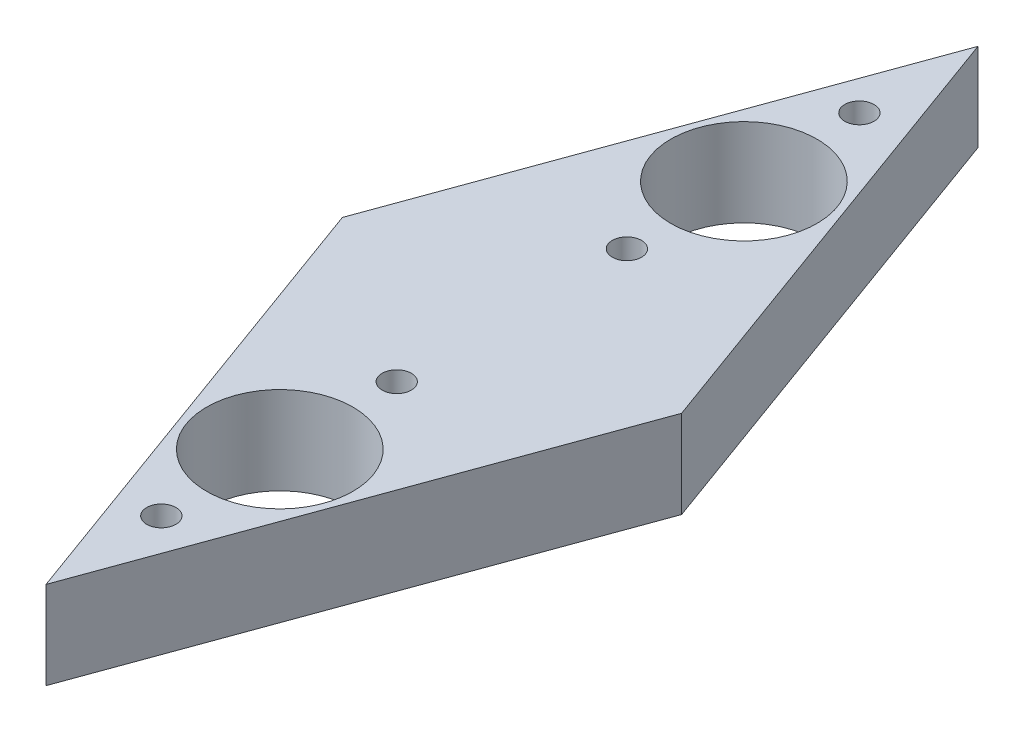
ISO-10303-21;
HEADER;
FILE_DESCRIPTION(('STEP AP214'),'2;1');
FILE_NAME('part.step','',(''),(''),'','','');
FILE_SCHEMA(('AUTOMOTIVE_DESIGN { 1 0 10303 214 1 1 1 1 }'));
ENDSEC;
DATA;
#1=APPLICATION_CONTEXT('core data for automotive mechanical design processes');
#2=APPLICATION_PROTOCOL_DEFINITION('international standard','automotive_design',2000,#1);
#3=PRODUCT_CONTEXT('',#1,'mechanical');
#4=PRODUCT('Part','Part','',(#3));
#5=PRODUCT_RELATED_PRODUCT_CATEGORY('part','',(#4));
#6=PRODUCT_DEFINITION_FORMATION('','',#4);
#7=PRODUCT_DEFINITION_CONTEXT('part definition',#1,'design');
#8=PRODUCT_DEFINITION('design','',#6,#7);
#9=PRODUCT_DEFINITION_SHAPE('','',#8);
#10=(LENGTH_UNIT() NAMED_UNIT(*) SI_UNIT(.MILLI.,.METRE.));
#11=(NAMED_UNIT(*) PLANE_ANGLE_UNIT() SI_UNIT($,.RADIAN.));
#12=(NAMED_UNIT(*) SI_UNIT($,.STERADIAN.) SOLID_ANGLE_UNIT());
#13=UNCERTAINTY_MEASURE_WITH_UNIT(LENGTH_MEASURE(1.E-05),#10,'distance_accuracy_value','');
#14=(GEOMETRIC_REPRESENTATION_CONTEXT(3) GLOBAL_UNCERTAINTY_ASSIGNED_CONTEXT((#13)) GLOBAL_UNIT_ASSIGNED_CONTEXT((#10,
#11,#12)) REPRESENTATION_CONTEXT('',''));
#15=CARTESIAN_POINT('',(0.,0.,0.));
#16=DIRECTION('',(0.,0.,1.));
#17=DIRECTION('',(1.,0.,0.));
#18=AXIS2_PLACEMENT_3D('',#15,#16,#17);
#19=CARTESIAN_POINT('',(0.,15.,0.));
#20=DIRECTION('',(-0.939692620785909,0.,-0.342020143325666));
#21=DIRECTION('',(-0.342020143325666,0.,0.93969262078591));
#22=AXIS2_PLACEMENT_3D('',#19,#20,#21);
#23=PLANE('',#22);
#24=DIRECTION('',(0.342020143325666,0.,-0.93969262078591));
#25=VECTOR('',#24,1.);
#26=CARTESIAN_POINT('',(0.,0.,0.));
#27=LINE('',#26,#25);
#28=CARTESIAN_POINT('',(0.,0.,0.));
#29=VERTEX_POINT('',#28);
#30=CARTESIAN_POINT('',(29.,0.,-79.6768451641848));
#31=VERTEX_POINT('',#30);
#32=EDGE_CURVE('E98',#29,#31,#27,.T.);
#33=ORIENTED_EDGE('',*,*,#32,.F.);
#34=DIRECTION('',(0.,-1.,0.));
#35=VECTOR('',#34,1.);
#36=CARTESIAN_POINT('',(0.,15.,0.));
#37=LINE('',#36,#35);
#38=CARTESIAN_POINT('',(0.,15.,0.));
#39=VERTEX_POINT('',#38);
#40=EDGE_CURVE('E11',#39,#29,#37,.T.);
#41=ORIENTED_EDGE('',*,*,#40,.F.);
#42=DIRECTION('',(0.342020143325666,0.,-0.93969262078591));
#43=VECTOR('',#42,1.);
#44=CARTESIAN_POINT('',(0.,15.,0.));
#45=LINE('',#44,#43);
#46=CARTESIAN_POINT('',(29.,15.,-79.6768451641848));
#47=VERTEX_POINT('',#46);
#48=EDGE_CURVE('E83',#39,#47,#45,.T.);
#49=ORIENTED_EDGE('',*,*,#48,.T.);
#50=DIRECTION('',(0.,-1.,0.));
#51=VECTOR('',#50,1.);
#52=CARTESIAN_POINT('',(29.,15.,-79.6768451641848));
#53=LINE('',#52,#51);
#54=EDGE_CURVE('E51',#47,#31,#53,.T.);
#55=ORIENTED_EDGE('',*,*,#54,.T.);
#56=EDGE_LOOP('',(#33,#41,#49,#55));
#57=FACE_BOUND('',#56,.T.);
#58=ADVANCED_FACE('F35',(#57),#23,.T.);
#59=CARTESIAN_POINT('',(0.,15.,0.));
#60=DIRECTION('',(0.939692620785909,0.,-0.342020143325666));
#61=DIRECTION('',(-0.342020143325666,0.,-0.93969262078591));
#62=AXIS2_PLACEMENT_3D('',#59,#60,#61);
#63=PLANE('',#62);
#64=DIRECTION('',(0.342020143325666,0.,0.93969262078591));
#65=VECTOR('',#64,1.);
#66=CARTESIAN_POINT('',(0.,0.,0.));
#67=LINE('',#66,#65);
#68=CARTESIAN_POINT('',(29.,0.,79.6768451641848));
#69=VERTEX_POINT('',#68);
#70=EDGE_CURVE('E89',#29,#69,#67,.T.);
#71=ORIENTED_EDGE('',*,*,#70,.T.);
#72=DIRECTION('',(0.,-1.,0.));
#73=VECTOR('',#72,1.);
#74=CARTESIAN_POINT('',(29.,15.,79.6768451641848));
#75=LINE('',#74,#73);
#76=CARTESIAN_POINT('',(29.,15.,79.6768451641848));
#77=VERTEX_POINT('',#76);
#78=EDGE_CURVE('E43',#77,#69,#75,.T.);
#79=ORIENTED_EDGE('',*,*,#78,.F.);
#80=DIRECTION('',(0.342020143325666,0.,0.93969262078591));
#81=VECTOR('',#80,1.);
#82=CARTESIAN_POINT('',(0.,15.,0.));
#83=LINE('',#82,#81);
#84=EDGE_CURVE('E77',#39,#77,#83,.T.);
#85=ORIENTED_EDGE('',*,*,#84,.F.);
#86=ORIENTED_EDGE('',*,*,#40,.T.);
#87=EDGE_LOOP('',(#71,#79,#85,#86));
#88=FACE_BOUND('',#87,.T.);
#89=ADVANCED_FACE('F87',(#88),#63,.F.);
#90=CARTESIAN_POINT('',(51.2152888504505,15.,18.6408406809095));
#91=DIRECTION('',(-0.939692620785909,0.,-0.342020143325666));
#92=DIRECTION('',(-0.342020143325666,0.,0.93969262078591));
#93=AXIS2_PLACEMENT_3D('',#90,#91,#92);
#94=PLANE('',#93);
#95=DIRECTION('',(0.342020143325666,0.,-0.939692620785909));
#96=VECTOR('',#95,1.);
#97=CARTESIAN_POINT('',(51.2152888504505,0.,18.6408406809095));
#98=LINE('',#97,#96);
#99=CARTESIAN_POINT('',(58.,0.,0.));
#100=VERTEX_POINT('',#99);
#101=EDGE_CURVE('E102',#69,#100,#98,.T.);
#102=ORIENTED_EDGE('',*,*,#101,.T.);
#103=DIRECTION('',(0.,-1.,0.));
#104=VECTOR('',#103,1.);
#105=CARTESIAN_POINT('',(58.,15.,0.));
#106=LINE('',#105,#104);
#107=CARTESIAN_POINT('',(58.,15.,0.));
#108=VERTEX_POINT('',#107);
#109=EDGE_CURVE('E65',#108,#100,#106,.T.);
#110=ORIENTED_EDGE('',*,*,#109,.F.);
#111=DIRECTION('',(0.342020143325666,0.,-0.939692620785909));
#112=VECTOR('',#111,1.);
#113=CARTESIAN_POINT('',(51.2152888504505,15.,18.6408406809095));
#114=LINE('',#113,#112);
#115=EDGE_CURVE('E82',#77,#108,#114,.T.);
#116=ORIENTED_EDGE('',*,*,#115,.F.);
#117=ORIENTED_EDGE('',*,*,#78,.T.);
#118=EDGE_LOOP('',(#102,#110,#116,#117));
#119=FACE_BOUND('',#118,.T.);
#120=ADVANCED_FACE('F92',(#119),#94,.F.);
#121=CARTESIAN_POINT('',(51.2152888504505,15.,-18.6408406809095));
#122=DIRECTION('',(0.939692620785909,0.,-0.342020143325666));
#123=DIRECTION('',(-0.342020143325666,0.,-0.93969262078591));
#124=AXIS2_PLACEMENT_3D('',#121,#122,#123);
#125=PLANE('',#124);
#126=DIRECTION('',(0.342020143325666,0.,0.939692620785909));
#127=VECTOR('',#126,1.);
#128=CARTESIAN_POINT('',(51.2152888504505,0.,-18.6408406809095));
#129=LINE('',#128,#127);
#130=EDGE_CURVE('E104',#31,#100,#129,.T.);
#131=ORIENTED_EDGE('',*,*,#130,.F.);
#132=ORIENTED_EDGE('',*,*,#54,.F.);
#133=DIRECTION('',(0.342020143325666,0.,0.939692620785909));
#134=VECTOR('',#133,1.);
#135=CARTESIAN_POINT('',(51.2152888504505,15.,-18.6408406809095));
#136=LINE('',#135,#134);
#137=EDGE_CURVE('E93',#47,#108,#136,.T.);
#138=ORIENTED_EDGE('',*,*,#137,.T.);
#139=ORIENTED_EDGE('',*,*,#109,.T.);
#140=EDGE_LOOP('',(#131,#132,#138,#139));
#141=FACE_BOUND('',#140,.T.);
#142=ADVANCED_FACE('F169',(#141),#125,.T.);
#143=CARTESIAN_POINT('',(0.,15.,0.));
#144=DIRECTION('',(0.,1.,0.));
#145=DIRECTION('',(0.,0.,1.));
#146=AXIS2_PLACEMENT_3D('',#143,#144,#145);
#147=PLANE('',#146);
#148=CARTESIAN_POINT('',(28.971190629352,15.,39.6768451641848));
#149=DIRECTION('',(0.,-1.,0.));
#150=DIRECTION('',(0.,0.,-1.));
#151=AXIS2_PLACEMENT_3D('',#148,#149,#150);
#152=CIRCLE('',#151,12.5);
#153=CARTESIAN_POINT('',(28.971190629352,15.,27.1768451641848));
#154=VERTEX_POINT('',#153);
#155=EDGE_CURVE('E113',#154,#154,#152,.T.);
#156=ORIENTED_EDGE('',*,*,#155,.T.);
#157=EDGE_LOOP('',(#156));
#158=FACE_BOUND('',#157,.T.);
#159=CARTESIAN_POINT('',(28.971190629352,15.,19.6768451641848));
#160=DIRECTION('',(0.,-1.,0.));
#161=DIRECTION('',(0.,0.,-1.));
#162=AXIS2_PLACEMENT_3D('',#159,#160,#161);
#163=CIRCLE('',#162,2.50000000000001);
#164=CARTESIAN_POINT('',(28.971190629352,15.,17.1768451641848));
#165=VERTEX_POINT('',#164);
#166=EDGE_CURVE('E137',#165,#165,#163,.T.);
#167=ORIENTED_EDGE('',*,*,#166,.T.);
#168=EDGE_LOOP('',(#167));
#169=FACE_BOUND('',#168,.T.);
#170=CARTESIAN_POINT('',(28.720595314676,15.,-59.6768451641848));
#171=DIRECTION('',(0.,-1.,0.));
#172=DIRECTION('',(0.,0.,1.));
#173=AXIS2_PLACEMENT_3D('',#170,#171,#172);
#174=CIRCLE('',#173,2.5);
#175=CARTESIAN_POINT('',(28.720595314676,15.,-57.1768451641848));
#176=VERTEX_POINT('',#175);
#177=EDGE_CURVE('E131',#176,#176,#174,.T.);
#178=ORIENTED_EDGE('',*,*,#177,.T.);
#179=EDGE_LOOP('',(#178));
#180=FACE_BOUND('',#179,.T.);
#181=CARTESIAN_POINT('',(28.971190629352,15.,-19.6768451641848));
#182=DIRECTION('',(0.,-1.,0.));
#183=DIRECTION('',(0.,0.,1.));
#184=AXIS2_PLACEMENT_3D('',#181,#182,#183);
#185=CIRCLE('',#184,2.50000000000001);
#186=CARTESIAN_POINT('',(28.971190629352,15.,-17.1768451641848));
#187=VERTEX_POINT('',#186);
#188=EDGE_CURVE('E125',#187,#187,#185,.T.);
#189=ORIENTED_EDGE('',*,*,#188,.T.);
#190=EDGE_LOOP('',(#189));
#191=FACE_BOUND('',#190,.T.);
#192=CARTESIAN_POINT('',(28.971190629352,15.,-39.6768451641848));
#193=DIRECTION('',(0.,-1.,0.));
#194=DIRECTION('',(0.,0.,1.));
#195=AXIS2_PLACEMENT_3D('',#192,#193,#194);
#196=CIRCLE('',#195,12.5);
#197=CARTESIAN_POINT('',(28.971190629352,15.,-27.1768451641848));
#198=VERTEX_POINT('',#197);
#199=EDGE_CURVE('E119',#198,#198,#196,.T.);
#200=ORIENTED_EDGE('',*,*,#199,.T.);
#201=EDGE_LOOP('',(#200));
#202=FACE_BOUND('',#201,.T.);
#203=CARTESIAN_POINT('',(28.720595314676,15.,59.6768451641848));
#204=DIRECTION('',(0.,-1.,0.));
#205=DIRECTION('',(0.,0.,-1.));
#206=AXIS2_PLACEMENT_3D('',#203,#204,#205);
#207=CIRCLE('',#206,2.5);
#208=CARTESIAN_POINT('',(28.720595314676,15.,57.1768451641848));
#209=VERTEX_POINT('',#208);
#210=EDGE_CURVE('E100',#209,#209,#207,.T.);
#211=ORIENTED_EDGE('',*,*,#210,.T.);
#212=EDGE_LOOP('',(#211));
#213=FACE_BOUND('',#212,.T.);
#214=ORIENTED_EDGE('',*,*,#48,.F.);
#215=ORIENTED_EDGE('',*,*,#84,.T.);
#216=ORIENTED_EDGE('',*,*,#115,.T.);
#217=ORIENTED_EDGE('',*,*,#137,.F.);
#218=EDGE_LOOP('',(#214,#215,#216,#217));
#219=FACE_BOUND('',#218,.T.);
#220=ADVANCED_FACE('F79',(#158,#169,#180,#191,#202,#213,#219),#147,.T.);
#221=CARTESIAN_POINT('',(0.,0.,0.));
#222=DIRECTION('',(0.,1.,0.));
#223=DIRECTION('',(0.,0.,1.));
#224=AXIS2_PLACEMENT_3D('',#221,#222,#223);
#225=PLANE('',#224);
#226=CARTESIAN_POINT('',(28.971190629352,0.,39.6768451641848));
#227=DIRECTION('',(0.,-1.,0.));
#228=DIRECTION('',(0.,0.,-1.));
#229=AXIS2_PLACEMENT_3D('',#226,#227,#228);
#230=CIRCLE('',#229,12.5);
#231=CARTESIAN_POINT('',(28.971190629352,0.,27.1768451641848));
#232=VERTEX_POINT('',#231);
#233=EDGE_CURVE('E140',#232,#232,#230,.T.);
#234=ORIENTED_EDGE('',*,*,#233,.F.);
#235=EDGE_LOOP('',(#234));
#236=FACE_BOUND('',#235,.T.);
#237=CARTESIAN_POINT('',(28.971190629352,0.,19.6768451641848));
#238=DIRECTION('',(0.,-1.,0.));
#239=DIRECTION('',(0.,0.,-1.));
#240=AXIS2_PLACEMENT_3D('',#237,#238,#239);
#241=CIRCLE('',#240,2.50000000000001);
#242=CARTESIAN_POINT('',(28.971190629352,0.,17.1768451641848));
#243=VERTEX_POINT('',#242);
#244=EDGE_CURVE('E134',#243,#243,#241,.T.);
#245=ORIENTED_EDGE('',*,*,#244,.F.);
#246=EDGE_LOOP('',(#245));
#247=FACE_BOUND('',#246,.T.);
#248=CARTESIAN_POINT('',(28.720595314676,0.,-59.6768451641848));
#249=DIRECTION('',(0.,-1.,0.));
#250=DIRECTION('',(0.,0.,1.));
#251=AXIS2_PLACEMENT_3D('',#248,#249,#250);
#252=CIRCLE('',#251,2.5);
#253=CARTESIAN_POINT('',(28.720595314676,0.,-57.1768451641848));
#254=VERTEX_POINT('',#253);
#255=EDGE_CURVE('E128',#254,#254,#252,.T.);
#256=ORIENTED_EDGE('',*,*,#255,.F.);
#257=EDGE_LOOP('',(#256));
#258=FACE_BOUND('',#257,.T.);
#259=CARTESIAN_POINT('',(28.971190629352,0.,-19.6768451641848));
#260=DIRECTION('',(0.,-1.,0.));
#261=DIRECTION('',(0.,0.,1.));
#262=AXIS2_PLACEMENT_3D('',#259,#260,#261);
#263=CIRCLE('',#262,2.50000000000001);
#264=CARTESIAN_POINT('',(28.971190629352,0.,-17.1768451641848));
#265=VERTEX_POINT('',#264);
#266=EDGE_CURVE('E122',#265,#265,#263,.T.);
#267=ORIENTED_EDGE('',*,*,#266,.F.);
#268=EDGE_LOOP('',(#267));
#269=FACE_BOUND('',#268,.T.);
#270=CARTESIAN_POINT('',(28.971190629352,0.,-39.6768451641848));
#271=DIRECTION('',(0.,-1.,0.));
#272=DIRECTION('',(0.,0.,1.));
#273=AXIS2_PLACEMENT_3D('',#270,#271,#272);
#274=CIRCLE('',#273,12.5);
#275=CARTESIAN_POINT('',(28.971190629352,0.,-27.1768451641848));
#276=VERTEX_POINT('',#275);
#277=EDGE_CURVE('E116',#276,#276,#274,.T.);
#278=ORIENTED_EDGE('',*,*,#277,.F.);
#279=EDGE_LOOP('',(#278));
#280=FACE_BOUND('',#279,.T.);
#281=CARTESIAN_POINT('',(28.720595314676,0.,59.6768451641848));
#282=DIRECTION('',(0.,-1.,0.));
#283=DIRECTION('',(0.,0.,-1.));
#284=AXIS2_PLACEMENT_3D('',#281,#282,#283);
#285=CIRCLE('',#284,2.5);
#286=CARTESIAN_POINT('',(28.720595314676,0.,57.1768451641848));
#287=VERTEX_POINT('',#286);
#288=EDGE_CURVE('E110',#287,#287,#285,.T.);
#289=ORIENTED_EDGE('',*,*,#288,.F.);
#290=EDGE_LOOP('',(#289));
#291=FACE_BOUND('',#290,.T.);
#292=ORIENTED_EDGE('',*,*,#32,.T.);
#293=ORIENTED_EDGE('',*,*,#130,.T.);
#294=ORIENTED_EDGE('',*,*,#101,.F.);
#295=ORIENTED_EDGE('',*,*,#70,.F.);
#296=EDGE_LOOP('',(#292,#293,#294,#295));
#297=FACE_BOUND('',#296,.T.);
#298=ADVANCED_FACE('F155',(#236,#247,#258,#269,#280,#291,#297),#225,.F.);
#299=CARTESIAN_POINT('',(28.720595314676,15.,59.6768451641848));
#300=DIRECTION('',(0.,-1.,0.));
#301=DIRECTION('',(0.,0.,-1.));
#302=AXIS2_PLACEMENT_3D('',#299,#300,#301);
#303=CYLINDRICAL_SURFACE('',#302,2.5);
#304=ORIENTED_EDGE('',*,*,#210,.F.);
#305=EDGE_LOOP('',(#304));
#306=FACE_BOUND('',#305,.T.);
#307=ORIENTED_EDGE('',*,*,#288,.T.);
#308=EDGE_LOOP('',(#307));
#309=FACE_BOUND('',#308,.T.);
#310=ADVANCED_FACE('F158',(#306,#309),#303,.F.);
#311=CARTESIAN_POINT('',(28.971190629352,15.,-39.6768451641848));
#312=DIRECTION('',(0.,-1.,0.));
#313=DIRECTION('',(0.,0.,-1.));
#314=AXIS2_PLACEMENT_3D('',#311,#312,#313);
#315=CYLINDRICAL_SURFACE('',#314,12.5);
#316=ORIENTED_EDGE('',*,*,#199,.F.);
#317=EDGE_LOOP('',(#316));
#318=FACE_BOUND('',#317,.T.);
#319=ORIENTED_EDGE('',*,*,#277,.T.);
#320=EDGE_LOOP('',(#319));
#321=FACE_BOUND('',#320,.T.);
#322=ADVANCED_FACE('F215',(#318,#321),#315,.F.);
#323=CARTESIAN_POINT('',(28.971190629352,15.,-19.6768451641848));
#324=DIRECTION('',(0.,-1.,0.));
#325=DIRECTION('',(0.,0.,-1.));
#326=AXIS2_PLACEMENT_3D('',#323,#324,#325);
#327=CYLINDRICAL_SURFACE('',#326,2.50000000000001);
#328=ORIENTED_EDGE('',*,*,#188,.F.);
#329=EDGE_LOOP('',(#328));
#330=FACE_BOUND('',#329,.T.);
#331=ORIENTED_EDGE('',*,*,#266,.T.);
#332=EDGE_LOOP('',(#331));
#333=FACE_BOUND('',#332,.T.);
#334=ADVANCED_FACE('F225',(#330,#333),#327,.F.);
#335=CARTESIAN_POINT('',(28.720595314676,15.,-59.6768451641848));
#336=DIRECTION('',(0.,-1.,0.));
#337=DIRECTION('',(0.,0.,-1.));
#338=AXIS2_PLACEMENT_3D('',#335,#336,#337);
#339=CYLINDRICAL_SURFACE('',#338,2.5);
#340=ORIENTED_EDGE('',*,*,#177,.F.);
#341=EDGE_LOOP('',(#340));
#342=FACE_BOUND('',#341,.T.);
#343=ORIENTED_EDGE('',*,*,#255,.T.);
#344=EDGE_LOOP('',(#343));
#345=FACE_BOUND('',#344,.T.);
#346=ADVANCED_FACE('F235',(#342,#345),#339,.F.);
#347=CARTESIAN_POINT('',(28.971190629352,15.,19.6768451641848));
#348=DIRECTION('',(0.,-1.,0.));
#349=DIRECTION('',(0.,0.,-1.));
#350=AXIS2_PLACEMENT_3D('',#347,#348,#349);
#351=CYLINDRICAL_SURFACE('',#350,2.50000000000001);
#352=ORIENTED_EDGE('',*,*,#166,.F.);
#353=EDGE_LOOP('',(#352));
#354=FACE_BOUND('',#353,.T.);
#355=ORIENTED_EDGE('',*,*,#244,.T.);
#356=EDGE_LOOP('',(#355));
#357=FACE_BOUND('',#356,.T.);
#358=ADVANCED_FACE('F151',(#354,#357),#351,.F.);
#359=CARTESIAN_POINT('',(28.971190629352,15.,39.6768451641848));
#360=DIRECTION('',(0.,-1.,0.));
#361=DIRECTION('',(0.,0.,-1.));
#362=AXIS2_PLACEMENT_3D('',#359,#360,#361);
#363=CYLINDRICAL_SURFACE('',#362,12.5);
#364=ORIENTED_EDGE('',*,*,#155,.F.);
#365=EDGE_LOOP('',(#364));
#366=FACE_BOUND('',#365,.T.);
#367=ORIENTED_EDGE('',*,*,#233,.T.);
#368=EDGE_LOOP('',(#367));
#369=FACE_BOUND('',#368,.T.);
#370=ADVANCED_FACE('F148',(#366,#369),#363,.F.);
#371=CLOSED_SHELL('',(#58,#89,#120,#142,#220,#298,#310,#322,#334,#346,#358,#370));
#372=MANIFOLD_SOLID_BREP('B2',#371);
#373=ADVANCED_BREP_SHAPE_REPRESENTATION('',(#18,#372),#14);
#374=SHAPE_DEFINITION_REPRESENTATION(#9,#373);
ENDSEC;
END-ISO-10303-21;
